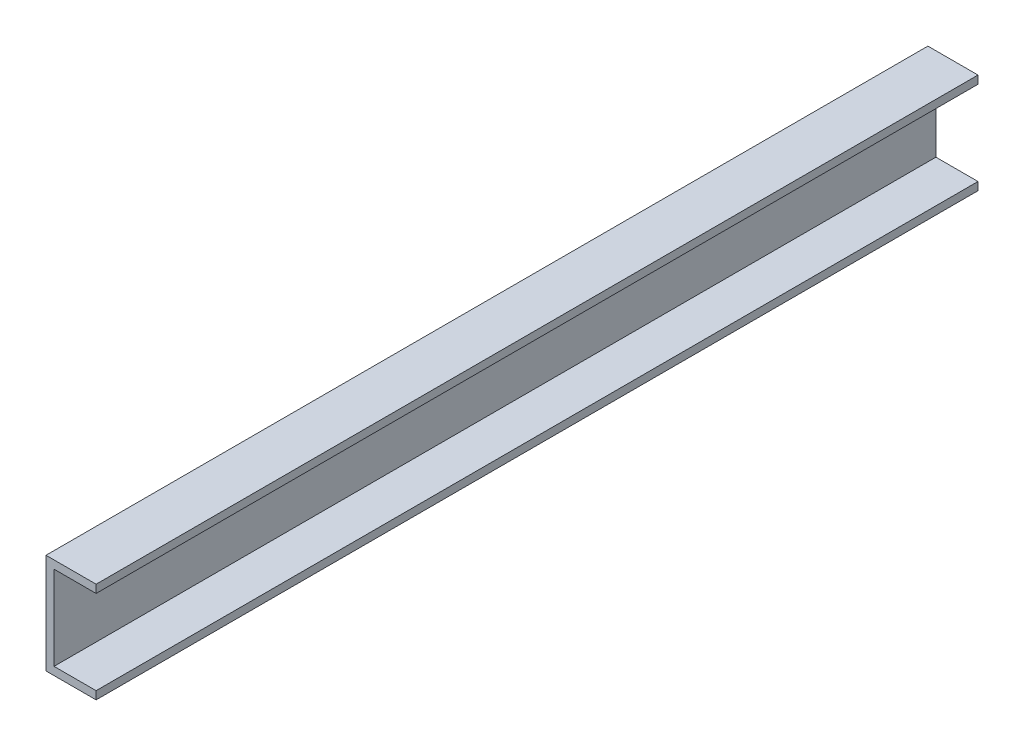
ISO-10303-21;
HEADER;
FILE_DESCRIPTION(('STEP AP214'),'2;1');
FILE_NAME('part.step','',(''),(''),'','','');
FILE_SCHEMA(('AUTOMOTIVE_DESIGN { 1 0 10303 214 1 1 1 1 }'));
ENDSEC;
DATA;
#1=APPLICATION_CONTEXT('core data for automotive mechanical design processes');
#2=APPLICATION_PROTOCOL_DEFINITION('international standard','automotive_design',2000,#1);
#3=PRODUCT_CONTEXT('',#1,'mechanical');
#4=PRODUCT('Part','Part','',(#3));
#5=PRODUCT_RELATED_PRODUCT_CATEGORY('part','',(#4));
#6=PRODUCT_DEFINITION_FORMATION('','',#4);
#7=PRODUCT_DEFINITION_CONTEXT('part definition',#1,'design');
#8=PRODUCT_DEFINITION('design','',#6,#7);
#9=PRODUCT_DEFINITION_SHAPE('','',#8);
#10=(LENGTH_UNIT() NAMED_UNIT(*) SI_UNIT(.MILLI.,.METRE.));
#11=(NAMED_UNIT(*) PLANE_ANGLE_UNIT() SI_UNIT($,.RADIAN.));
#12=(NAMED_UNIT(*) SI_UNIT($,.STERADIAN.) SOLID_ANGLE_UNIT());
#13=UNCERTAINTY_MEASURE_WITH_UNIT(LENGTH_MEASURE(1.E-05),#10,'distance_accuracy_value','');
#14=(GEOMETRIC_REPRESENTATION_CONTEXT(3) GLOBAL_UNCERTAINTY_ASSIGNED_CONTEXT((#13)) GLOBAL_UNIT_ASSIGNED_CONTEXT((#10,
#11,#12)) REPRESENTATION_CONTEXT('',''));
#15=CARTESIAN_POINT('',(0.,0.,0.));
#16=DIRECTION('',(0.,0.,1.));
#17=DIRECTION('',(1.,0.,0.));
#18=AXIS2_PLACEMENT_3D('',#15,#16,#17);
#19=CARTESIAN_POINT('',(0.,0.,880.));
#20=DIRECTION('',(0.,-1.,0.));
#21=DIRECTION('',(0.,0.,-1.));
#22=AXIS2_PLACEMENT_3D('',#19,#20,#21);
#23=PLANE('',#22);
#24=DIRECTION('',(-1.,0.,0.));
#25=VECTOR('',#24,1.);
#26=CARTESIAN_POINT('',(0.,0.,0.));
#27=LINE('',#26,#25);
#28=CARTESIAN_POINT('',(50.,0.,0.));
#29=VERTEX_POINT('',#28);
#30=CARTESIAN_POINT('',(0.,0.,0.));
#31=VERTEX_POINT('',#30);
#32=EDGE_CURVE('E129',#29,#31,#27,.T.);
#33=ORIENTED_EDGE('',*,*,#32,.T.);
#34=DIRECTION('',(0.,0.,-1.));
#35=VECTOR('',#34,1.);
#36=CARTESIAN_POINT('',(0.,0.,880.));
#37=LINE('',#36,#35);
#38=CARTESIAN_POINT('',(0.,0.,880.));
#39=VERTEX_POINT('',#38);
#40=EDGE_CURVE('E11',#39,#31,#37,.T.);
#41=ORIENTED_EDGE('',*,*,#40,.F.);
#42=DIRECTION('',(-1.,0.,0.));
#43=VECTOR('',#42,1.);
#44=CARTESIAN_POINT('',(0.,0.,880.));
#45=LINE('',#44,#43);
#46=CARTESIAN_POINT('',(50.,0.,880.));
#47=VERTEX_POINT('',#46);
#48=EDGE_CURVE('E143',#47,#39,#45,.T.);
#49=ORIENTED_EDGE('',*,*,#48,.F.);
#50=DIRECTION('',(0.,0.,-1.));
#51=VECTOR('',#50,1.);
#52=CARTESIAN_POINT('',(50.,0.,880.));
#53=LINE('',#52,#51);
#54=EDGE_CURVE('E125',#47,#29,#53,.T.);
#55=ORIENTED_EDGE('',*,*,#54,.T.);
#56=EDGE_LOOP('',(#33,#41,#49,#55));
#57=FACE_BOUND('',#56,.T.);
#58=ADVANCED_FACE('F33',(#57),#23,.F.);
#59=CARTESIAN_POINT('',(0.,0.,880.));
#60=DIRECTION('',(1.,0.,0.));
#61=DIRECTION('',(0.,0.,-1.));
#62=AXIS2_PLACEMENT_3D('',#59,#60,#61);
#63=PLANE('',#62);
#64=DIRECTION('',(0.,-1.,0.));
#65=VECTOR('',#64,1.);
#66=CARTESIAN_POINT('',(0.,0.,0.));
#67=LINE('',#66,#65);
#68=CARTESIAN_POINT('',(0.,-100.,0.));
#69=VERTEX_POINT('',#68);
#70=EDGE_CURVE('E132',#31,#69,#67,.T.);
#71=ORIENTED_EDGE('',*,*,#70,.T.);
#72=DIRECTION('',(0.,0.,-1.));
#73=VECTOR('',#72,1.);
#74=CARTESIAN_POINT('',(0.,-100.,880.));
#75=LINE('',#74,#73);
#76=CARTESIAN_POINT('',(0.,-100.,880.));
#77=VERTEX_POINT('',#76);
#78=EDGE_CURVE('E41',#77,#69,#75,.T.);
#79=ORIENTED_EDGE('',*,*,#78,.F.);
#80=DIRECTION('',(0.,-1.,0.));
#81=VECTOR('',#80,1.);
#82=CARTESIAN_POINT('',(0.,0.,880.));
#83=LINE('',#82,#81);
#84=EDGE_CURVE('E92',#39,#77,#83,.T.);
#85=ORIENTED_EDGE('',*,*,#84,.F.);
#86=ORIENTED_EDGE('',*,*,#40,.T.);
#87=EDGE_LOOP('',(#71,#79,#85,#86));
#88=FACE_BOUND('',#87,.T.);
#89=ADVANCED_FACE('F178',(#88),#63,.F.);
#90=CARTESIAN_POINT('',(0.,-100.,880.));
#91=DIRECTION('',(0.,1.,0.));
#92=DIRECTION('',(0.,0.,1.));
#93=AXIS2_PLACEMENT_3D('',#90,#91,#92);
#94=PLANE('',#93);
#95=DIRECTION('',(1.,0.,0.));
#96=VECTOR('',#95,1.);
#97=CARTESIAN_POINT('',(0.,-100.,0.));
#98=LINE('',#97,#96);
#99=CARTESIAN_POINT('',(50.,-100.,0.));
#100=VERTEX_POINT('',#99);
#101=EDGE_CURVE('E134',#69,#100,#98,.T.);
#102=ORIENTED_EDGE('',*,*,#101,.T.);
#103=DIRECTION('',(0.,0.,-1.));
#104=VECTOR('',#103,1.);
#105=CARTESIAN_POINT('',(50.,-100.,880.));
#106=LINE('',#105,#104);
#107=CARTESIAN_POINT('',(50.,-100.,880.));
#108=VERTEX_POINT('',#107);
#109=EDGE_CURVE('E150',#108,#100,#106,.T.);
#110=ORIENTED_EDGE('',*,*,#109,.F.);
#111=DIRECTION('',(1.,0.,0.));
#112=VECTOR('',#111,1.);
#113=CARTESIAN_POINT('',(0.,-100.,880.));
#114=LINE('',#113,#112);
#115=EDGE_CURVE('E158',#77,#108,#114,.T.);
#116=ORIENTED_EDGE('',*,*,#115,.F.);
#117=ORIENTED_EDGE('',*,*,#78,.T.);
#118=EDGE_LOOP('',(#102,#110,#116,#117));
#119=FACE_BOUND('',#118,.T.);
#120=ADVANCED_FACE('F156',(#119),#94,.F.);
#121=CARTESIAN_POINT('',(50.,-100.,880.));
#122=DIRECTION('',(-1.,0.,0.));
#123=DIRECTION('',(0.,0.,1.));
#124=AXIS2_PLACEMENT_3D('',#121,#122,#123);
#125=PLANE('',#124);
#126=DIRECTION('',(0.,1.,0.));
#127=VECTOR('',#126,1.);
#128=CARTESIAN_POINT('',(50.,-100.,0.));
#129=LINE('',#128,#127);
#130=CARTESIAN_POINT('',(50.,-92.,0.));
#131=VERTEX_POINT('',#130);
#132=EDGE_CURVE('E136',#100,#131,#129,.T.);
#133=ORIENTED_EDGE('',*,*,#132,.T.);
#134=DIRECTION('',(0.,0.,-1.));
#135=VECTOR('',#134,1.);
#136=CARTESIAN_POINT('',(50.,-92.,880.));
#137=LINE('',#136,#135);
#138=CARTESIAN_POINT('',(50.,-92.,880.));
#139=VERTEX_POINT('',#138);
#140=EDGE_CURVE('E147',#139,#131,#137,.T.);
#141=ORIENTED_EDGE('',*,*,#140,.F.);
#142=DIRECTION('',(0.,1.,0.));
#143=VECTOR('',#142,1.);
#144=CARTESIAN_POINT('',(50.,-100.,880.));
#145=LINE('',#144,#143);
#146=EDGE_CURVE('E170',#108,#139,#145,.T.);
#147=ORIENTED_EDGE('',*,*,#146,.F.);
#148=ORIENTED_EDGE('',*,*,#109,.T.);
#149=EDGE_LOOP('',(#133,#141,#147,#148));
#150=FACE_BOUND('',#149,.T.);
#151=ADVANCED_FACE('F166',(#150),#125,.F.);
#152=CARTESIAN_POINT('',(50.,-92.,880.));
#153=DIRECTION('',(0.,-1.,0.));
#154=DIRECTION('',(0.,0.,-1.));
#155=AXIS2_PLACEMENT_3D('',#152,#153,#154);
#156=PLANE('',#155);
#157=DIRECTION('',(-1.,0.,0.));
#158=VECTOR('',#157,1.);
#159=CARTESIAN_POINT('',(50.,-92.,0.));
#160=LINE('',#159,#158);
#161=CARTESIAN_POINT('',(8.00000000000001,-92.,0.));
#162=VERTEX_POINT('',#161);
#163=EDGE_CURVE('E138',#131,#162,#160,.T.);
#164=ORIENTED_EDGE('',*,*,#163,.T.);
#165=DIRECTION('',(0.,0.,-1.));
#166=VECTOR('',#165,1.);
#167=CARTESIAN_POINT('',(8.00000000000001,-92.,880.));
#168=LINE('',#167,#166);
#169=CARTESIAN_POINT('',(8.00000000000001,-92.,880.));
#170=VERTEX_POINT('',#169);
#171=EDGE_CURVE('E120',#170,#162,#168,.T.);
#172=ORIENTED_EDGE('',*,*,#171,.F.);
#173=DIRECTION('',(-1.,0.,0.));
#174=VECTOR('',#173,1.);
#175=CARTESIAN_POINT('',(50.,-92.,880.));
#176=LINE('',#175,#174);
#177=EDGE_CURVE('E111',#139,#170,#176,.T.);
#178=ORIENTED_EDGE('',*,*,#177,.F.);
#179=ORIENTED_EDGE('',*,*,#140,.T.);
#180=EDGE_LOOP('',(#164,#172,#178,#179));
#181=FACE_BOUND('',#180,.T.);
#182=ADVANCED_FACE('F169',(#181),#156,.F.);
#183=CARTESIAN_POINT('',(8.00000000000001,-92.,880.));
#184=DIRECTION('',(-1.,0.,0.));
#185=DIRECTION('',(0.,-1.,0.));
#186=AXIS2_PLACEMENT_3D('',#183,#184,#185);
#187=PLANE('',#186);
#188=DIRECTION('',(0.,1.,0.));
#189=VECTOR('',#188,1.);
#190=CARTESIAN_POINT('',(8.00000000000001,-92.,0.));
#191=LINE('',#190,#189);
#192=CARTESIAN_POINT('',(8.00000000000001,-8.00000000000001,0.));
#193=VERTEX_POINT('',#192);
#194=EDGE_CURVE('E119',#162,#193,#191,.T.);
#195=ORIENTED_EDGE('',*,*,#194,.T.);
#196=DIRECTION('',(0.,0.,-1.));
#197=VECTOR('',#196,1.);
#198=CARTESIAN_POINT('',(8.00000000000001,-8.00000000000001,880.));
#199=LINE('',#198,#197);
#200=CARTESIAN_POINT('',(8.00000000000001,-8.00000000000001,880.));
#201=VERTEX_POINT('',#200);
#202=EDGE_CURVE('E116',#201,#193,#199,.T.);
#203=ORIENTED_EDGE('',*,*,#202,.F.);
#204=DIRECTION('',(0.,1.,0.));
#205=VECTOR('',#204,1.);
#206=CARTESIAN_POINT('',(8.00000000000001,-92.,880.));
#207=LINE('',#206,#205);
#208=EDGE_CURVE('E105',#170,#201,#207,.T.);
#209=ORIENTED_EDGE('',*,*,#208,.F.);
#210=ORIENTED_EDGE('',*,*,#171,.T.);
#211=EDGE_LOOP('',(#195,#203,#209,#210));
#212=FACE_BOUND('',#211,.T.);
#213=ADVANCED_FACE('F117',(#212),#187,.F.);
#214=CARTESIAN_POINT('',(50.,-8.00000000000001,880.));
#215=DIRECTION('',(0.,1.,0.));
#216=DIRECTION('',(0.,0.,1.));
#217=AXIS2_PLACEMENT_3D('',#214,#215,#216);
#218=PLANE('',#217);
#219=DIRECTION('',(1.,0.,0.));
#220=VECTOR('',#219,1.);
#221=CARTESIAN_POINT('',(50.,-8.00000000000001,0.));
#222=LINE('',#221,#220);
#223=CARTESIAN_POINT('',(50.,-8.00000000000001,0.));
#224=VERTEX_POINT('',#223);
#225=EDGE_CURVE('E78',#193,#224,#222,.T.);
#226=ORIENTED_EDGE('',*,*,#225,.T.);
#227=DIRECTION('',(0.,0.,-1.));
#228=VECTOR('',#227,1.);
#229=CARTESIAN_POINT('',(50.,-8.00000000000001,880.));
#230=LINE('',#229,#228);
#231=CARTESIAN_POINT('',(50.,-8.00000000000001,880.));
#232=VERTEX_POINT('',#231);
#233=EDGE_CURVE('E121',#232,#224,#230,.T.);
#234=ORIENTED_EDGE('',*,*,#233,.F.);
#235=DIRECTION('',(1.,0.,0.));
#236=VECTOR('',#235,1.);
#237=CARTESIAN_POINT('',(50.,-8.00000000000001,880.));
#238=LINE('',#237,#236);
#239=EDGE_CURVE('E109',#201,#232,#238,.T.);
#240=ORIENTED_EDGE('',*,*,#239,.F.);
#241=ORIENTED_EDGE('',*,*,#202,.T.);
#242=EDGE_LOOP('',(#226,#234,#240,#241));
#243=FACE_BOUND('',#242,.T.);
#244=ADVANCED_FACE('F123',(#243),#218,.F.);
#245=CARTESIAN_POINT('',(50.,0.,880.));
#246=DIRECTION('',(-1.,0.,0.));
#247=DIRECTION('',(0.,0.,1.));
#248=AXIS2_PLACEMENT_3D('',#245,#246,#247);
#249=PLANE('',#248);
#250=DIRECTION('',(0.,1.,0.));
#251=VECTOR('',#250,1.);
#252=CARTESIAN_POINT('',(50.,0.,0.));
#253=LINE('',#252,#251);
#254=EDGE_CURVE('E84',#224,#29,#253,.T.);
#255=ORIENTED_EDGE('',*,*,#254,.T.);
#256=ORIENTED_EDGE('',*,*,#54,.F.);
#257=DIRECTION('',(0.,1.,0.));
#258=VECTOR('',#257,1.);
#259=CARTESIAN_POINT('',(50.,0.,880.));
#260=LINE('',#259,#258);
#261=EDGE_CURVE('E49',#232,#47,#260,.T.);
#262=ORIENTED_EDGE('',*,*,#261,.F.);
#263=ORIENTED_EDGE('',*,*,#233,.T.);
#264=EDGE_LOOP('',(#255,#256,#262,#263));
#265=FACE_BOUND('',#264,.T.);
#266=ADVANCED_FACE('F194',(#265),#249,.F.);
#267=CARTESIAN_POINT('',(0.,0.,880.));
#268=DIRECTION('',(0.,0.,-1.));
#269=DIRECTION('',(-1.,0.,0.));
#270=AXIS2_PLACEMENT_3D('',#267,#268,#269);
#271=PLANE('',#270);
#272=ORIENTED_EDGE('',*,*,#48,.T.);
#273=ORIENTED_EDGE('',*,*,#84,.T.);
#274=ORIENTED_EDGE('',*,*,#115,.T.);
#275=ORIENTED_EDGE('',*,*,#146,.T.);
#276=ORIENTED_EDGE('',*,*,#177,.T.);
#277=ORIENTED_EDGE('',*,*,#208,.T.);
#278=ORIENTED_EDGE('',*,*,#239,.T.);
#279=ORIENTED_EDGE('',*,*,#261,.T.);
#280=EDGE_LOOP('',(#272,#273,#274,#275,#276,#277,#278,#279));
#281=FACE_BOUND('',#280,.T.);
#282=ADVANCED_FACE('F107',(#281),#271,.F.);
#283=CARTESIAN_POINT('',(0.,0.,0.));
#284=DIRECTION('',(0.,0.,-1.));
#285=DIRECTION('',(-1.,0.,0.));
#286=AXIS2_PLACEMENT_3D('',#283,#284,#285);
#287=PLANE('',#286);
#288=ORIENTED_EDGE('',*,*,#32,.F.);
#289=ORIENTED_EDGE('',*,*,#254,.F.);
#290=ORIENTED_EDGE('',*,*,#225,.F.);
#291=ORIENTED_EDGE('',*,*,#194,.F.);
#292=ORIENTED_EDGE('',*,*,#163,.F.);
#293=ORIENTED_EDGE('',*,*,#132,.F.);
#294=ORIENTED_EDGE('',*,*,#101,.F.);
#295=ORIENTED_EDGE('',*,*,#70,.F.);
#296=EDGE_LOOP('',(#288,#289,#290,#291,#292,#293,#294,#295));
#297=FACE_BOUND('',#296,.T.);
#298=ADVANCED_FACE('F162',(#297),#287,.T.);
#299=CLOSED_SHELL('',(#58,#89,#120,#151,#182,#213,#244,#266,#282,#298));
#300=MANIFOLD_SOLID_BREP('B2',#299);
#301=ADVANCED_BREP_SHAPE_REPRESENTATION('',(#18,#300),#14);
#302=SHAPE_DEFINITION_REPRESENTATION(#9,#301);
ENDSEC;
END-ISO-10303-21;
